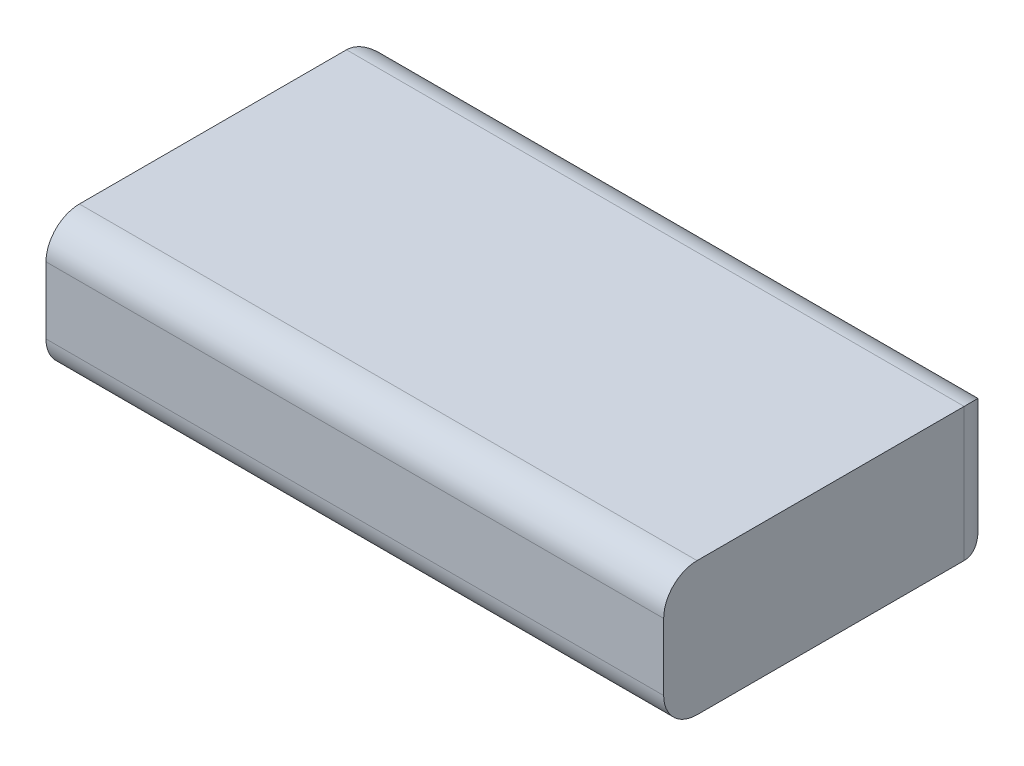
ISO-10303-21;
HEADER;
FILE_DESCRIPTION(('STEP AP214'),'2;1');
FILE_NAME('part.step','',(''),(''),'','','');
FILE_SCHEMA(('AUTOMOTIVE_DESIGN { 1 0 10303 214 1 1 1 1 }'));
ENDSEC;
DATA;
#1=APPLICATION_CONTEXT('core data for automotive mechanical design processes');
#2=APPLICATION_PROTOCOL_DEFINITION('international standard','automotive_design',2000,#1);
#3=PRODUCT_CONTEXT('',#1,'mechanical');
#4=PRODUCT('Part','Part','',(#3));
#5=PRODUCT_RELATED_PRODUCT_CATEGORY('part','',(#4));
#6=PRODUCT_DEFINITION_FORMATION('','',#4);
#7=PRODUCT_DEFINITION_CONTEXT('part definition',#1,'design');
#8=PRODUCT_DEFINITION('design','',#6,#7);
#9=PRODUCT_DEFINITION_SHAPE('','',#8);
#10=(LENGTH_UNIT() NAMED_UNIT(*) SI_UNIT(.MILLI.,.METRE.));
#11=(NAMED_UNIT(*) PLANE_ANGLE_UNIT() SI_UNIT($,.RADIAN.));
#12=(NAMED_UNIT(*) SI_UNIT($,.STERADIAN.) SOLID_ANGLE_UNIT());
#13=UNCERTAINTY_MEASURE_WITH_UNIT(LENGTH_MEASURE(1.E-05),#10,'distance_accuracy_value','');
#14=(GEOMETRIC_REPRESENTATION_CONTEXT(3) GLOBAL_UNCERTAINTY_ASSIGNED_CONTEXT((#13)) GLOBAL_UNIT_ASSIGNED_CONTEXT((#10,
#11,#12)) REPRESENTATION_CONTEXT('',''));
#15=CARTESIAN_POINT('',(0.,0.,0.));
#16=DIRECTION('',(0.,0.,1.));
#17=DIRECTION('',(1.,0.,0.));
#18=AXIS2_PLACEMENT_3D('',#15,#16,#17);
#19=CARTESIAN_POINT('',(0.,8.,0.));
#20=DIRECTION('',(1.,0.,0.));
#21=DIRECTION('',(0.,0.,-1.));
#22=AXIS2_PLACEMENT_3D('',#19,#20,#21);
#23=PLANE('',#22);
#24=DIRECTION('',(0.,0.,1.));
#25=VECTOR('',#24,1.);
#26=CARTESIAN_POINT('',(0.,8.,0.));
#27=LINE('',#26,#25);
#28=CARTESIAN_POINT('',(0.,8.,-18.));
#29=VERTEX_POINT('',#28);
#30=CARTESIAN_POINT('',(0.,8.,-2.));
#31=VERTEX_POINT('',#30);
#32=EDGE_CURVE('E101',#29,#31,#27,.T.);
#33=ORIENTED_EDGE('',*,*,#32,.F.);
#34=DIRECTION('',(0.,-1.,0.));
#35=VECTOR('',#34,1.);
#36=CARTESIAN_POINT('',(0.,8.,-18.));
#37=LINE('',#36,#35);
#38=CARTESIAN_POINT('',(0.,0.,-18.));
#39=VERTEX_POINT('',#38);
#40=EDGE_CURVE('E57',#29,#39,#37,.T.);
#41=ORIENTED_EDGE('',*,*,#40,.T.);
#42=DIRECTION('',(0.,0.,1.));
#43=VECTOR('',#42,1.);
#44=CARTESIAN_POINT('',(0.,0.,0.));
#45=LINE('',#44,#43);
#46=CARTESIAN_POINT('',(0.,0.,-2.));
#47=VERTEX_POINT('',#46);
#48=EDGE_CURVE('E161',#39,#47,#45,.T.);
#49=ORIENTED_EDGE('',*,*,#48,.T.);
#50=CARTESIAN_POINT('',(0.,2.,-2.));
#51=DIRECTION('',(1.,0.,0.));
#52=DIRECTION('',(0.,0.,-1.));
#53=AXIS2_PLACEMENT_3D('',#50,#51,#52);
#54=CIRCLE('',#53,2.);
#55=CARTESIAN_POINT('',(0.,2.,0.));
#56=VERTEX_POINT('',#55);
#57=EDGE_CURVE('E146',#47,#56,#54,.F.);
#58=ORIENTED_EDGE('',*,*,#57,.T.);
#59=DIRECTION('',(0.,-1.,0.));
#60=VECTOR('',#59,1.);
#61=CARTESIAN_POINT('',(0.,8.,0.));
#62=LINE('',#61,#60);
#63=CARTESIAN_POINT('',(0.,6.,0.));
#64=VERTEX_POINT('',#63);
#65=EDGE_CURVE('E117',#64,#56,#62,.T.);
#66=ORIENTED_EDGE('',*,*,#65,.F.);
#67=CARTESIAN_POINT('',(0.,6.,-2.));
#68=DIRECTION('',(1.,0.,0.));
#69=DIRECTION('',(0.,0.,-1.));
#70=AXIS2_PLACEMENT_3D('',#67,#68,#69);
#71=CIRCLE('',#70,2.);
#72=EDGE_CURVE('E115',#64,#31,#71,.F.);
#73=ORIENTED_EDGE('',*,*,#72,.T.);
#74=EDGE_LOOP('',(#33,#41,#49,#58,#66,#73));
#75=FACE_BOUND('',#74,.T.);
#76=ADVANCED_FACE('F33',(#75),#23,.F.);
#77=CARTESIAN_POINT('',(0.,8.,0.));
#78=DIRECTION('',(0.,0.,-1.));
#79=DIRECTION('',(-1.,0.,0.));
#80=AXIS2_PLACEMENT_3D('',#77,#78,#79);
#81=PLANE('',#80);
#82=ORIENTED_EDGE('',*,*,#65,.T.);
#83=DIRECTION('',(1.,0.,0.));
#84=VECTOR('',#83,1.);
#85=CARTESIAN_POINT('',(37.,2.,0.));
#86=LINE('',#85,#84);
#87=CARTESIAN_POINT('',(37.,2.,0.));
#88=VERTEX_POINT('',#87);
#89=EDGE_CURVE('E11',#56,#88,#86,.T.);
#90=ORIENTED_EDGE('',*,*,#89,.T.);
#91=DIRECTION('',(0.,-1.,0.));
#92=VECTOR('',#91,1.);
#93=CARTESIAN_POINT('',(37.,8.,0.));
#94=LINE('',#93,#92);
#95=CARTESIAN_POINT('',(37.,6.,0.));
#96=VERTEX_POINT('',#95);
#97=EDGE_CURVE('E127',#96,#88,#94,.T.);
#98=ORIENTED_EDGE('',*,*,#97,.F.);
#99=DIRECTION('',(1.,0.,0.));
#100=VECTOR('',#99,1.);
#101=CARTESIAN_POINT('',(0.,6.,0.));
#102=LINE('',#101,#100);
#103=EDGE_CURVE('E121',#96,#64,#102,.F.);
#104=ORIENTED_EDGE('',*,*,#103,.T.);
#105=EDGE_LOOP('',(#82,#90,#98,#104));
#106=FACE_BOUND('',#105,.T.);
#107=ADVANCED_FACE('F195',(#106),#81,.F.);
#108=CARTESIAN_POINT('',(37.,8.,0.));
#109=DIRECTION('',(-1.,0.,0.));
#110=DIRECTION('',(0.,0.,1.));
#111=AXIS2_PLACEMENT_3D('',#108,#109,#110);
#112=PLANE('',#111);
#113=DIRECTION('',(0.,0.,-1.));
#114=VECTOR('',#113,1.);
#115=CARTESIAN_POINT('',(37.,0.,0.));
#116=LINE('',#115,#114);
#117=CARTESIAN_POINT('',(37.,0.,-2.));
#118=VERTEX_POINT('',#117);
#119=CARTESIAN_POINT('',(37.,0.,-18.));
#120=VERTEX_POINT('',#119);
#121=EDGE_CURVE('E111',#118,#120,#116,.T.);
#122=ORIENTED_EDGE('',*,*,#121,.T.);
#123=DIRECTION('',(0.,-1.,0.));
#124=VECTOR('',#123,1.);
#125=CARTESIAN_POINT('',(37.,8.,-18.));
#126=LINE('',#125,#124);
#127=CARTESIAN_POINT('',(37.,8.,-18.));
#128=VERTEX_POINT('',#127);
#129=EDGE_CURVE('E142',#120,#128,#126,.F.);
#130=ORIENTED_EDGE('',*,*,#129,.T.);
#131=DIRECTION('',(0.,0.,-1.));
#132=VECTOR('',#131,1.);
#133=CARTESIAN_POINT('',(37.,8.,0.));
#134=LINE('',#133,#132);
#135=CARTESIAN_POINT('',(37.,8.,-2.));
#136=VERTEX_POINT('',#135);
#137=EDGE_CURVE('E110',#136,#128,#134,.T.);
#138=ORIENTED_EDGE('',*,*,#137,.F.);
#139=CARTESIAN_POINT('',(37.,6.,-2.));
#140=DIRECTION('',(-1.,0.,0.));
#141=DIRECTION('',(0.,0.,1.));
#142=AXIS2_PLACEMENT_3D('',#139,#140,#141);
#143=CIRCLE('',#142,2.);
#144=EDGE_CURVE('E124',#136,#96,#143,.F.);
#145=ORIENTED_EDGE('',*,*,#144,.T.);
#146=ORIENTED_EDGE('',*,*,#97,.T.);
#147=CARTESIAN_POINT('',(37.,2.,-2.));
#148=DIRECTION('',(-1.,0.,0.));
#149=DIRECTION('',(0.,0.,1.));
#150=AXIS2_PLACEMENT_3D('',#147,#148,#149);
#151=CIRCLE('',#150,2.);
#152=EDGE_CURVE('E140',#88,#118,#151,.F.);
#153=ORIENTED_EDGE('',*,*,#152,.T.);
#154=EDGE_LOOP('',(#122,#130,#138,#145,#146,#153));
#155=FACE_BOUND('',#154,.T.);
#156=ADVANCED_FACE('F173',(#155),#112,.F.);
#157=CARTESIAN_POINT('',(0.,8.,-20.));
#158=DIRECTION('',(0.,0.,1.));
#159=DIRECTION('',(1.,0.,0.));
#160=AXIS2_PLACEMENT_3D('',#157,#158,#159);
#161=PLANE('',#160);
#162=DIRECTION('',(-1.,0.,0.));
#163=VECTOR('',#162,1.);
#164=CARTESIAN_POINT('',(0.,6.,-20.));
#165=LINE('',#164,#163);
#166=CARTESIAN_POINT('',(2.,6.,-20.));
#167=VERTEX_POINT('',#166);
#168=CARTESIAN_POINT('',(35.,6.,-20.));
#169=VERTEX_POINT('',#168);
#170=EDGE_CURVE('E135',#167,#169,#165,.F.);
#171=ORIENTED_EDGE('',*,*,#170,.T.);
#172=DIRECTION('',(0.,-1.,0.));
#173=VECTOR('',#172,1.);
#174=CARTESIAN_POINT('',(35.,8.,-20.));
#175=LINE('',#174,#173);
#176=CARTESIAN_POINT('',(35.,2.,-20.));
#177=VERTEX_POINT('',#176);
#178=EDGE_CURVE('E137',#169,#177,#175,.T.);
#179=ORIENTED_EDGE('',*,*,#178,.T.);
#180=DIRECTION('',(-1.,0.,0.));
#181=VECTOR('',#180,1.);
#182=CARTESIAN_POINT('',(0.,2.,-20.));
#183=LINE('',#182,#181);
#184=CARTESIAN_POINT('',(2.,2.,-20.));
#185=VERTEX_POINT('',#184);
#186=EDGE_CURVE('E120',#177,#185,#183,.T.);
#187=ORIENTED_EDGE('',*,*,#186,.T.);
#188=DIRECTION('',(0.,-1.,0.));
#189=VECTOR('',#188,1.);
#190=CARTESIAN_POINT('',(2.,8.,-20.));
#191=LINE('',#190,#189);
#192=EDGE_CURVE('E133',#185,#167,#191,.F.);
#193=ORIENTED_EDGE('',*,*,#192,.T.);
#194=EDGE_LOOP('',(#171,#179,#187,#193));
#195=FACE_BOUND('',#194,.T.);
#196=ADVANCED_FACE('F183',(#195),#161,.F.);
#197=CARTESIAN_POINT('',(0.,8.,0.));
#198=DIRECTION('',(0.,-1.,0.));
#199=DIRECTION('',(0.,0.,-1.));
#200=AXIS2_PLACEMENT_3D('',#197,#198,#199);
#201=PLANE('',#200);
#202=ORIENTED_EDGE('',*,*,#137,.T.);
#203=DIRECTION('',(-1.,0.,0.));
#204=VECTOR('',#203,1.);
#205=CARTESIAN_POINT('',(0.,8.,-18.));
#206=LINE('',#205,#204);
#207=EDGE_CURVE('E109',#128,#29,#206,.T.);
#208=ORIENTED_EDGE('',*,*,#207,.T.);
#209=ORIENTED_EDGE('',*,*,#32,.T.);
#210=DIRECTION('',(1.,0.,0.));
#211=VECTOR('',#210,1.);
#212=CARTESIAN_POINT('',(0.,8.,-2.));
#213=LINE('',#212,#211);
#214=EDGE_CURVE('E106',#31,#136,#213,.T.);
#215=ORIENTED_EDGE('',*,*,#214,.T.);
#216=EDGE_LOOP('',(#202,#208,#209,#215));
#217=FACE_BOUND('',#216,.T.);
#218=ADVANCED_FACE('F104',(#217),#201,.F.);
#219=CARTESIAN_POINT('',(0.,0.,0.));
#220=DIRECTION('',(0.,-1.,0.));
#221=DIRECTION('',(0.,0.,-1.));
#222=AXIS2_PLACEMENT_3D('',#219,#220,#221);
#223=PLANE('',#222);
#224=ORIENTED_EDGE('',*,*,#48,.F.);
#225=DIRECTION('',(-1.,0.,0.));
#226=VECTOR('',#225,1.);
#227=CARTESIAN_POINT('',(37.,0.,-18.));
#228=LINE('',#227,#226);
#229=EDGE_CURVE('E42',#39,#120,#228,.F.);
#230=ORIENTED_EDGE('',*,*,#229,.T.);
#231=ORIENTED_EDGE('',*,*,#121,.F.);
#232=DIRECTION('',(1.,0.,0.));
#233=VECTOR('',#232,1.);
#234=CARTESIAN_POINT('',(0.,0.,-2.));
#235=LINE('',#234,#233);
#236=EDGE_CURVE('E50',#118,#47,#235,.F.);
#237=ORIENTED_EDGE('',*,*,#236,.T.);
#238=EDGE_LOOP('',(#224,#230,#231,#237));
#239=FACE_BOUND('',#238,.T.);
#240=ADVANCED_FACE('F206',(#239),#223,.T.);
#241=CARTESIAN_POINT('',(0.,6.,-2.));
#242=DIRECTION('',(1.,0.,0.));
#243=DIRECTION('',(0.,0.,-1.));
#244=AXIS2_PLACEMENT_3D('',#241,#242,#243);
#245=CYLINDRICAL_SURFACE('',#244,2.);
#246=ORIENTED_EDGE('',*,*,#72,.F.);
#247=ORIENTED_EDGE('',*,*,#103,.F.);
#248=ORIENTED_EDGE('',*,*,#144,.F.);
#249=ORIENTED_EDGE('',*,*,#214,.F.);
#250=EDGE_LOOP('',(#246,#247,#248,#249));
#251=FACE_BOUND('',#250,.T.);
#252=ADVANCED_FACE('F123',(#251),#245,.T.);
#253=CARTESIAN_POINT('',(2.,8.,-18.));
#254=DIRECTION('',(0.,-1.,0.));
#255=DIRECTION('',(0.,0.,-1.));
#256=AXIS2_PLACEMENT_3D('',#253,#254,#255);
#257=CYLINDRICAL_SURFACE('',#256,2.);
#258=CARTESIAN_POINT('',(2.,2.,-18.));
#259=DIRECTION('',(0.707106781186547,-0.707106781186547,0.));
#260=DIRECTION('',(0.707106781186547,0.707106781186547,0.));
#261=AXIS2_PLACEMENT_3D('',#258,#259,#260);
#262=ELLIPSE('',#261,2.82842712474619,2.);
#263=EDGE_CURVE('E154',#39,#185,#262,.T.);
#264=ORIENTED_EDGE('',*,*,#263,.F.);
#265=ORIENTED_EDGE('',*,*,#40,.F.);
#266=CARTESIAN_POINT('',(2.,6.,-18.));
#267=DIRECTION('',(-0.707106781186547,-0.707106781186547,0.));
#268=DIRECTION('',(0.707106781186547,-0.707106781186547,0.));
#269=AXIS2_PLACEMENT_3D('',#266,#267,#268);
#270=ELLIPSE('',#269,2.82842712474619,2.);
#271=EDGE_CURVE('E37',#167,#29,#270,.F.);
#272=ORIENTED_EDGE('',*,*,#271,.F.);
#273=ORIENTED_EDGE('',*,*,#192,.F.);
#274=EDGE_LOOP('',(#264,#265,#272,#273));
#275=FACE_BOUND('',#274,.T.);
#276=ADVANCED_FACE('F186',(#275),#257,.T.);
#277=CARTESIAN_POINT('',(0.,6.,-18.));
#278=DIRECTION('',(-1.,0.,0.));
#279=DIRECTION('',(0.,0.,1.));
#280=AXIS2_PLACEMENT_3D('',#277,#278,#279);
#281=CYLINDRICAL_SURFACE('',#280,2.);
#282=ORIENTED_EDGE('',*,*,#271,.T.);
#283=ORIENTED_EDGE('',*,*,#207,.F.);
#284=CARTESIAN_POINT('',(35.,6.,-18.));
#285=DIRECTION('',(-0.707106781186547,0.707106781186547,0.));
#286=DIRECTION('',(-0.707106781186547,-0.707106781186547,0.));
#287=AXIS2_PLACEMENT_3D('',#284,#285,#286);
#288=ELLIPSE('',#287,2.82842712474619,2.);
#289=EDGE_CURVE('E153',#169,#128,#288,.F.);
#290=ORIENTED_EDGE('',*,*,#289,.F.);
#291=ORIENTED_EDGE('',*,*,#170,.F.);
#292=EDGE_LOOP('',(#282,#283,#290,#291));
#293=FACE_BOUND('',#292,.T.);
#294=ADVANCED_FACE('F184',(#293),#281,.T.);
#295=CARTESIAN_POINT('',(0.,2.,-18.));
#296=DIRECTION('',(1.,0.,0.));
#297=DIRECTION('',(0.,0.,-1.));
#298=AXIS2_PLACEMENT_3D('',#295,#296,#297);
#299=CYLINDRICAL_SURFACE('',#298,2.);
#300=ORIENTED_EDGE('',*,*,#263,.T.);
#301=ORIENTED_EDGE('',*,*,#186,.F.);
#302=CARTESIAN_POINT('',(35.,2.,-18.));
#303=DIRECTION('',(0.707106781186547,0.707106781186547,0.));
#304=DIRECTION('',(0.707106781186547,-0.707106781186547,0.));
#305=AXIS2_PLACEMENT_3D('',#302,#303,#304);
#306=ELLIPSE('',#305,2.82842712474619,2.);
#307=EDGE_CURVE('E151',#120,#177,#306,.T.);
#308=ORIENTED_EDGE('',*,*,#307,.F.);
#309=ORIENTED_EDGE('',*,*,#229,.F.);
#310=EDGE_LOOP('',(#300,#301,#308,#309));
#311=FACE_BOUND('',#310,.T.);
#312=ADVANCED_FACE('F180',(#311),#299,.T.);
#313=CARTESIAN_POINT('',(35.,8.,-18.));
#314=DIRECTION('',(0.,-1.,0.));
#315=DIRECTION('',(0.,0.,-1.));
#316=AXIS2_PLACEMENT_3D('',#313,#314,#315);
#317=CYLINDRICAL_SURFACE('',#316,2.);
#318=ORIENTED_EDGE('',*,*,#289,.T.);
#319=ORIENTED_EDGE('',*,*,#129,.F.);
#320=ORIENTED_EDGE('',*,*,#307,.T.);
#321=ORIENTED_EDGE('',*,*,#178,.F.);
#322=EDGE_LOOP('',(#318,#319,#320,#321));
#323=FACE_BOUND('',#322,.T.);
#324=ADVANCED_FACE('F177',(#323),#317,.T.);
#325=CARTESIAN_POINT('',(0.,2.,-2.));
#326=DIRECTION('',(-1.,0.,0.));
#327=DIRECTION('',(0.,0.,1.));
#328=AXIS2_PLACEMENT_3D('',#325,#326,#327);
#329=CYLINDRICAL_SURFACE('',#328,2.);
#330=ORIENTED_EDGE('',*,*,#57,.F.);
#331=ORIENTED_EDGE('',*,*,#236,.F.);
#332=ORIENTED_EDGE('',*,*,#152,.F.);
#333=ORIENTED_EDGE('',*,*,#89,.F.);
#334=EDGE_LOOP('',(#330,#331,#332,#333));
#335=FACE_BOUND('',#334,.T.);
#336=ADVANCED_FACE('F35',(#335),#329,.T.);
#337=CLOSED_SHELL('',(#76,#107,#156,#196,#218,#240,#252,#276,#294,#312,#324,#336));
#338=MANIFOLD_SOLID_BREP('B2',#337);
#339=ADVANCED_BREP_SHAPE_REPRESENTATION('',(#18,#338),#14);
#340=SHAPE_DEFINITION_REPRESENTATION(#9,#339);
ENDSEC;
END-ISO-10303-21;
